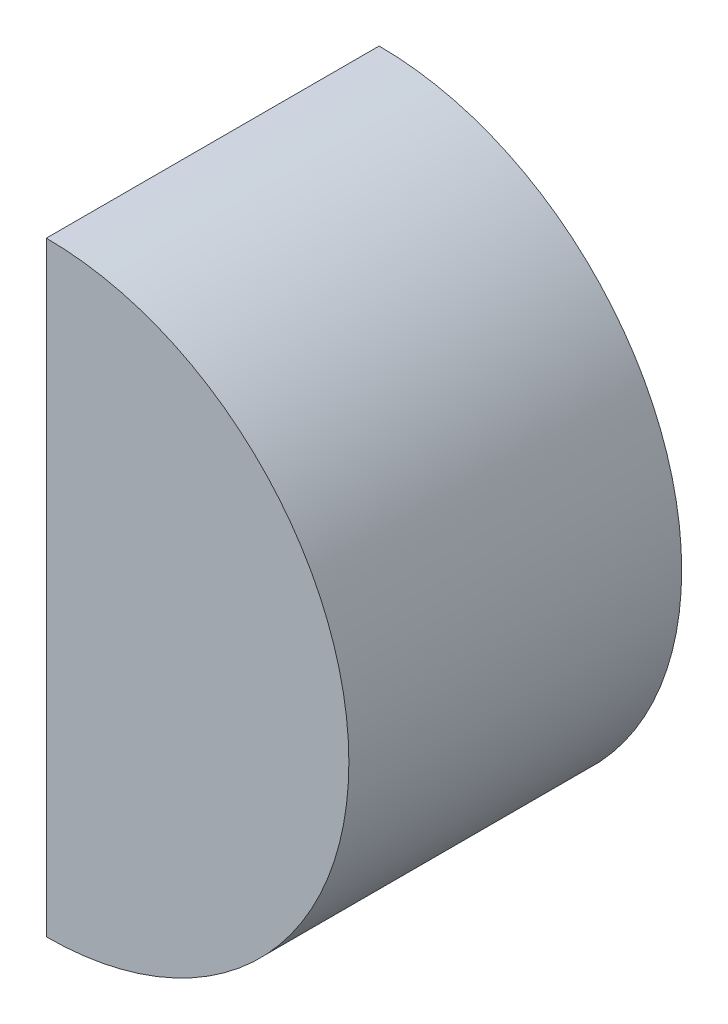
ISO-10303-21;
HEADER;
FILE_DESCRIPTION(('STEP AP214'),'2;1');
FILE_NAME('part.step','',(''),(''),'','','');
FILE_SCHEMA(('AUTOMOTIVE_DESIGN { 1 0 10303 214 1 1 1 1 }'));
ENDSEC;
DATA;
#1=APPLICATION_CONTEXT('core data for automotive mechanical design processes');
#2=APPLICATION_PROTOCOL_DEFINITION('international standard','automotive_design',2000,#1);
#3=PRODUCT_CONTEXT('',#1,'mechanical');
#4=PRODUCT('Part','Part','',(#3));
#5=PRODUCT_RELATED_PRODUCT_CATEGORY('part','',(#4));
#6=PRODUCT_DEFINITION_FORMATION('','',#4);
#7=PRODUCT_DEFINITION_CONTEXT('part definition',#1,'design');
#8=PRODUCT_DEFINITION('design','',#6,#7);
#9=PRODUCT_DEFINITION_SHAPE('','',#8);
#10=(LENGTH_UNIT() NAMED_UNIT(*) SI_UNIT(.MILLI.,.METRE.));
#11=(NAMED_UNIT(*) PLANE_ANGLE_UNIT() SI_UNIT($,.RADIAN.));
#12=(NAMED_UNIT(*) SI_UNIT($,.STERADIAN.) SOLID_ANGLE_UNIT());
#13=UNCERTAINTY_MEASURE_WITH_UNIT(LENGTH_MEASURE(1.E-05),#10,'distance_accuracy_value','');
#14=(GEOMETRIC_REPRESENTATION_CONTEXT(3) GLOBAL_UNCERTAINTY_ASSIGNED_CONTEXT((#13)) GLOBAL_UNIT_ASSIGNED_CONTEXT((#10,
#11,#12)) REPRESENTATION_CONTEXT('',''));
#15=CARTESIAN_POINT('',(0.,0.,0.));
#16=DIRECTION('',(0.,0.,1.));
#17=DIRECTION('',(1.,0.,0.));
#18=AXIS2_PLACEMENT_3D('',#15,#16,#17);
#19=CARTESIAN_POINT('',(12.,17.,11.));
#20=DIRECTION('',(0.,0.,-1.));
#21=DIRECTION('',(-1.,0.,0.));
#22=AXIS2_PLACEMENT_3D('',#19,#20,#21);
#23=CYLINDRICAL_SURFACE('',#22,10.);
#24=CARTESIAN_POINT('',(12.,17.,0.));
#25=DIRECTION('',(0.,0.,1.));
#26=DIRECTION('',(1.,0.,0.));
#27=AXIS2_PLACEMENT_3D('',#24,#25,#26);
#28=CIRCLE('',#27,10.);
#29=CARTESIAN_POINT('',(12.,7.,0.));
#30=VERTEX_POINT('',#29);
#31=CARTESIAN_POINT('',(12.,27.,0.));
#32=VERTEX_POINT('',#31);
#33=EDGE_CURVE('E72',#30,#32,#28,.T.);
#34=ORIENTED_EDGE('',*,*,#33,.T.);
#35=DIRECTION('',(0.,0.,-1.));
#36=VECTOR('',#35,1.);
#37=CARTESIAN_POINT('',(12.,27.,11.));
#38=LINE('',#37,#36);
#39=CARTESIAN_POINT('',(12.,27.,11.));
#40=VERTEX_POINT('',#39);
#41=EDGE_CURVE('E11',#40,#32,#38,.T.);
#42=ORIENTED_EDGE('',*,*,#41,.F.);
#43=CARTESIAN_POINT('',(12.,17.,11.));
#44=DIRECTION('',(0.,0.,1.));
#45=DIRECTION('',(1.,0.,0.));
#46=AXIS2_PLACEMENT_3D('',#43,#44,#45);
#47=CIRCLE('',#46,10.);
#48=CARTESIAN_POINT('',(12.,7.,11.));
#49=VERTEX_POINT('',#48);
#50=EDGE_CURVE('E71',#49,#40,#47,.T.);
#51=ORIENTED_EDGE('',*,*,#50,.F.);
#52=DIRECTION('',(0.,0.,-1.));
#53=VECTOR('',#52,1.);
#54=CARTESIAN_POINT('',(12.,7.,11.));
#55=LINE('',#54,#53);
#56=EDGE_CURVE('E49',#49,#30,#55,.T.);
#57=ORIENTED_EDGE('',*,*,#56,.T.);
#58=EDGE_LOOP('',(#34,#42,#51,#57));
#59=FACE_BOUND('',#58,.T.);
#60=ADVANCED_FACE('F41',(#59),#23,.T.);
#61=CARTESIAN_POINT('',(12.,27.,11.));
#62=DIRECTION('',(1.,0.,0.));
#63=DIRECTION('',(0.,0.,-1.));
#64=AXIS2_PLACEMENT_3D('',#61,#62,#63);
#65=PLANE('',#64);
#66=DIRECTION('',(0.,-1.,0.));
#67=VECTOR('',#66,1.);
#68=CARTESIAN_POINT('',(12.,27.,0.));
#69=LINE('',#68,#67);
#70=EDGE_CURVE('E64',#32,#30,#69,.T.);
#71=ORIENTED_EDGE('',*,*,#70,.T.);
#72=ORIENTED_EDGE('',*,*,#56,.F.);
#73=DIRECTION('',(0.,-1.,0.));
#74=VECTOR('',#73,1.);
#75=CARTESIAN_POINT('',(12.,27.,11.));
#76=LINE('',#75,#74);
#77=EDGE_CURVE('E56',#40,#49,#76,.T.);
#78=ORIENTED_EDGE('',*,*,#77,.F.);
#79=ORIENTED_EDGE('',*,*,#41,.T.);
#80=EDGE_LOOP('',(#71,#72,#78,#79));
#81=FACE_BOUND('',#80,.T.);
#82=ADVANCED_FACE('F67',(#81),#65,.F.);
#83=CARTESIAN_POINT('',(12.,17.,11.));
#84=DIRECTION('',(0.,0.,1.));
#85=DIRECTION('',(1.,0.,0.));
#86=AXIS2_PLACEMENT_3D('',#83,#84,#85);
#87=PLANE('',#86);
#88=ORIENTED_EDGE('',*,*,#50,.T.);
#89=ORIENTED_EDGE('',*,*,#77,.T.);
#90=EDGE_LOOP('',(#88,#89));
#91=FACE_BOUND('',#90,.T.);
#92=ADVANCED_FACE('F79',(#91),#87,.T.);
#93=CARTESIAN_POINT('',(12.,17.,0.));
#94=DIRECTION('',(0.,0.,1.));
#95=DIRECTION('',(1.,0.,0.));
#96=AXIS2_PLACEMENT_3D('',#93,#94,#95);
#97=PLANE('',#96);
#98=ORIENTED_EDGE('',*,*,#33,.F.);
#99=ORIENTED_EDGE('',*,*,#70,.F.);
#100=EDGE_LOOP('',(#98,#99));
#101=FACE_BOUND('',#100,.T.);
#102=ADVANCED_FACE('F75',(#101),#97,.F.);
#103=CLOSED_SHELL('',(#60,#82,#92,#102));
#104=MANIFOLD_SOLID_BREP('B2',#103);
#105=ADVANCED_BREP_SHAPE_REPRESENTATION('',(#18,#104),#14);
#106=SHAPE_DEFINITION_REPRESENTATION(#9,#105);
ENDSEC;
END-ISO-10303-21;
